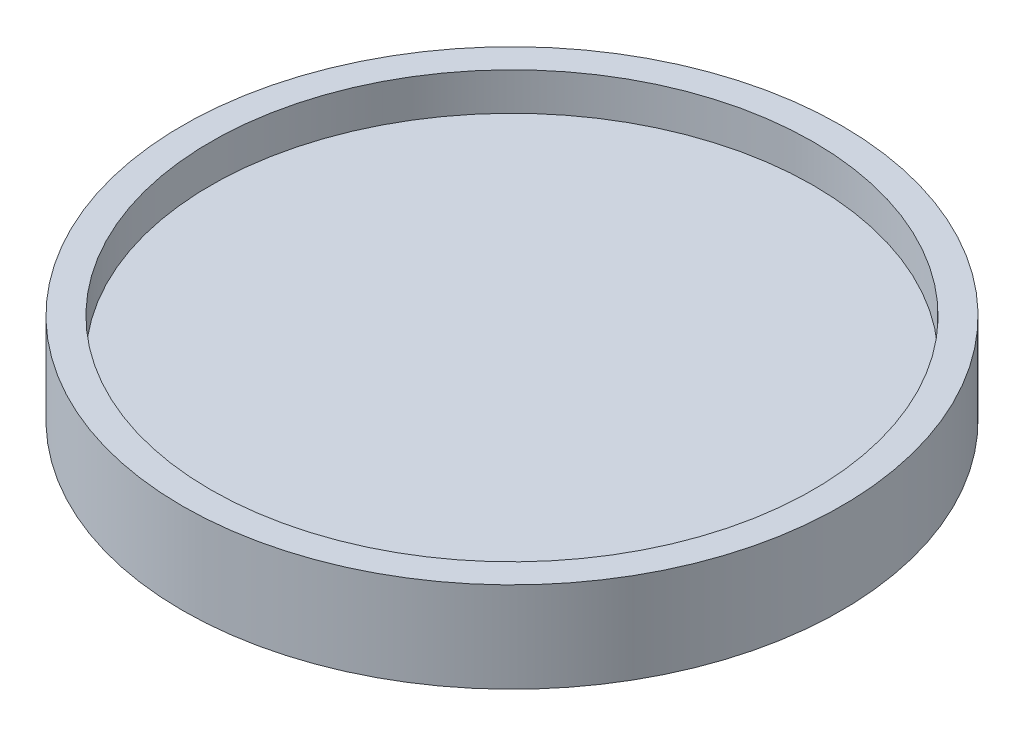
ISO-10303-21;
HEADER;
FILE_DESCRIPTION(('STEP AP214'),'2;1');
FILE_NAME('part.step','',(''),(''),'','','');
FILE_SCHEMA(('AUTOMOTIVE_DESIGN { 1 0 10303 214 1 1 1 1 }'));
ENDSEC;
DATA;
#1=APPLICATION_CONTEXT('core data for automotive mechanical design processes');
#2=APPLICATION_PROTOCOL_DEFINITION('international standard','automotive_design',2000,#1);
#3=PRODUCT_CONTEXT('',#1,'mechanical');
#4=PRODUCT('Part','Part','',(#3));
#5=PRODUCT_RELATED_PRODUCT_CATEGORY('part','',(#4));
#6=PRODUCT_DEFINITION_FORMATION('','',#4);
#7=PRODUCT_DEFINITION_CONTEXT('part definition',#1,'design');
#8=PRODUCT_DEFINITION('design','',#6,#7);
#9=PRODUCT_DEFINITION_SHAPE('','',#8);
#10=(LENGTH_UNIT() NAMED_UNIT(*) SI_UNIT(.MILLI.,.METRE.));
#11=(NAMED_UNIT(*) PLANE_ANGLE_UNIT() SI_UNIT($,.RADIAN.));
#12=(NAMED_UNIT(*) SI_UNIT($,.STERADIAN.) SOLID_ANGLE_UNIT());
#13=UNCERTAINTY_MEASURE_WITH_UNIT(LENGTH_MEASURE(1.E-05),#10,'distance_accuracy_value','');
#14=(GEOMETRIC_REPRESENTATION_CONTEXT(3) GLOBAL_UNCERTAINTY_ASSIGNED_CONTEXT((#13)) GLOBAL_UNIT_ASSIGNED_CONTEXT((#10,
#11,#12)) REPRESENTATION_CONTEXT('',''));
#15=CARTESIAN_POINT('',(0.,0.,0.));
#16=DIRECTION('',(0.,0.,1.));
#17=DIRECTION('',(1.,0.,0.));
#18=AXIS2_PLACEMENT_3D('',#15,#16,#17);
#19=CARTESIAN_POINT('',(0.,3.048,0.));
#20=DIRECTION('',(0.,-1.,0.));
#21=DIRECTION('',(0.,0.,-1.));
#22=AXIS2_PLACEMENT_3D('',#19,#20,#21);
#23=CYLINDRICAL_SURFACE('',#22,11.1125);
#24=CARTESIAN_POINT('',(0.,3.048,0.));
#25=DIRECTION('',(0.,1.,0.));
#26=DIRECTION('',(0.,0.,1.));
#27=AXIS2_PLACEMENT_3D('',#24,#25,#26);
#28=CIRCLE('',#27,11.1125);
#29=CARTESIAN_POINT('',(0.,3.048,-11.1125));
#30=VERTEX_POINT('',#29);
#31=EDGE_CURVE('E45',#30,#30,#28,.T.);
#32=CARTESIAN_POINT('',(0.,0.,0.));
#33=DIRECTION('',(0.,1.,0.));
#34=DIRECTION('',(0.,0.,1.));
#35=AXIS2_PLACEMENT_3D('',#32,#33,#34);
#36=CIRCLE('',#35,11.1125);
#37=CARTESIAN_POINT('',(0.,0.,-11.1125));
#38=VERTEX_POINT('',#37);
#39=EDGE_CURVE('E50',#38,#38,#36,.T.);
#40=CARTESIAN_POINT('',(0.,3.048,-11.1125));
#41=CARTESIAN_POINT('',(0.,3.01625,-11.1125));
#42=CARTESIAN_POINT('',(0.,2.9845,-11.1125));
#43=CARTESIAN_POINT('',(0.,2.921,-11.1125));
#44=CARTESIAN_POINT('',(0.,2.88925,-11.1125));
#45=CARTESIAN_POINT('',(0.,2.82575,-11.1125));
#46=CARTESIAN_POINT('',(0.,2.794,-11.1125));
#47=CARTESIAN_POINT('',(0.,2.7305,-11.1125));
#48=CARTESIAN_POINT('',(0.,2.69875,-11.1125));
#49=CARTESIAN_POINT('',(0.,2.63525,-11.1125));
#50=CARTESIAN_POINT('',(0.,2.6035,-11.1125));
#51=CARTESIAN_POINT('',(0.,2.54,-11.1125));
#52=CARTESIAN_POINT('',(0.,2.50825,-11.1125));
#53=CARTESIAN_POINT('',(0.,2.44475,-11.1125));
#54=CARTESIAN_POINT('',(0.,2.413,-11.1125));
#55=CARTESIAN_POINT('',(0.,2.3495,-11.1125));
#56=CARTESIAN_POINT('',(0.,2.31775,-11.1125));
#57=CARTESIAN_POINT('',(0.,2.25425,-11.1125));
#58=CARTESIAN_POINT('',(0.,2.2225,-11.1125));
#59=CARTESIAN_POINT('',(0.,2.159,-11.1125));
#60=CARTESIAN_POINT('',(0.,2.12725,-11.1125));
#61=CARTESIAN_POINT('',(0.,2.06375,-11.1125));
#62=CARTESIAN_POINT('',(0.,2.032,-11.1125));
#63=CARTESIAN_POINT('',(0.,1.9685,-11.1125));
#64=CARTESIAN_POINT('',(0.,1.93675,-11.1125));
#65=CARTESIAN_POINT('',(0.,1.87325,-11.1125));
#66=CARTESIAN_POINT('',(0.,1.8415,-11.1125));
#67=CARTESIAN_POINT('',(0.,1.778,-11.1125));
#68=CARTESIAN_POINT('',(0.,1.74625,-11.1125));
#69=CARTESIAN_POINT('',(0.,1.68275,-11.1125));
#70=CARTESIAN_POINT('',(0.,1.651,-11.1125));
#71=CARTESIAN_POINT('',(0.,1.5875,-11.1125));
#72=CARTESIAN_POINT('',(0.,1.55575,-11.1125));
#73=CARTESIAN_POINT('',(0.,1.49225,-11.1125));
#74=CARTESIAN_POINT('',(0.,1.4605,-11.1125));
#75=CARTESIAN_POINT('',(0.,1.397,-11.1125));
#76=CARTESIAN_POINT('',(0.,1.36525,-11.1125));
#77=CARTESIAN_POINT('',(0.,1.30175,-11.1125));
#78=CARTESIAN_POINT('',(0.,1.27,-11.1125));
#79=CARTESIAN_POINT('',(0.,1.2065,-11.1125));
#80=CARTESIAN_POINT('',(0.,1.17475,-11.1125));
#81=CARTESIAN_POINT('',(0.,1.11125,-11.1125));
#82=CARTESIAN_POINT('',(0.,1.0795,-11.1125));
#83=CARTESIAN_POINT('',(0.,1.016,-11.1125));
#84=CARTESIAN_POINT('',(0.,0.98425,-11.1125));
#85=CARTESIAN_POINT('',(0.,0.92075,-11.1125));
#86=CARTESIAN_POINT('',(0.,0.889,-11.1125));
#87=CARTESIAN_POINT('',(0.,0.8255,-11.1125));
#88=CARTESIAN_POINT('',(0.,0.79375,-11.1125));
#89=CARTESIAN_POINT('',(0.,0.73025,-11.1125));
#90=CARTESIAN_POINT('',(0.,0.6985,-11.1125));
#91=CARTESIAN_POINT('',(0.,0.635,-11.1125));
#92=CARTESIAN_POINT('',(0.,0.60325,-11.1125));
#93=CARTESIAN_POINT('',(0.,0.53975,-11.1125));
#94=CARTESIAN_POINT('',(0.,0.508,-11.1125));
#95=CARTESIAN_POINT('',(0.,0.4445,-11.1125));
#96=CARTESIAN_POINT('',(0.,0.41275,-11.1125));
#97=CARTESIAN_POINT('',(0.,0.34925,-11.1125));
#98=CARTESIAN_POINT('',(0.,0.3175,-11.1125));
#99=CARTESIAN_POINT('',(0.,0.254,-11.1125));
#100=CARTESIAN_POINT('',(0.,0.22225,-11.1125));
#101=CARTESIAN_POINT('',(0.,0.15875,-11.1125));
#102=CARTESIAN_POINT('',(0.,0.127,-11.1125));
#103=CARTESIAN_POINT('',(0.,0.0634999999999999,-11.1125));
#104=CARTESIAN_POINT('',(0.,0.03175,-11.1125));
#105=CARTESIAN_POINT('',(0.,0.,-11.1125));
#106=B_SPLINE_CURVE_WITH_KNOTS('',3,(#40,#41,#42,#43,#44,#45,#46,#47,#48,#49,#50,#51,#52,#53,
#54,#55,#56,#57,#58,#59,#60,#61,#62,#63,#64,#65,#66,#67,#68,#69,#70,#71,#72,#73,#74,#75,#76,#77,
#78,#79,#80,#81,#82,#83,#84,#85,#86,#87,#88,#89,#90,#91,#92,#93,#94,#95,#96,#97,#98,#99,#100,
#101,#102,#103,#104,#105),.UNSPECIFIED.,.F.,.F.,(4,2,2,2,2,2,2,2,2,2,2,2,2,2,2,2,2,2,2,2,2,2,2,
2,2,2,2,2,2,2,2,2,4),(0.,0.0952499999999998,0.1905,0.28575,0.381,0.47625,0.5715,0.66675,0.762,
0.85725,0.9525,1.04775,1.143,1.23825,1.3335,1.42875,1.524,1.61925,1.7145,1.80975,1.905,2.00025,
2.0955,2.19075,2.286,2.38125,2.4765,2.57175,2.667,2.76225,2.8575,2.95275,3.048),.UNSPECIFIED.);
#107=EDGE_CURVE('BSEAM37',#30,#38,#106,.T.);
#108=ORIENTED_EDGE('',*,*,#31,.F.);
#109=ORIENTED_EDGE('',*,*,#39,.T.);
#110=ORIENTED_EDGE('',*,*,#107,.T.);
#111=ORIENTED_EDGE('',*,*,#107,.F.);
#112=EDGE_LOOP('',(#108,#110,#109,#111));
#113=FACE_BOUND('',#112,.T.);
#114=ADVANCED_FACE('F37',(#113),#23,.T.);
#115=CARTESIAN_POINT('',(0.,3.048,0.));
#116=DIRECTION('',(0.,1.,0.));
#117=DIRECTION('',(0.,0.,1.));
#118=AXIS2_PLACEMENT_3D('',#115,#116,#117);
#119=PLANE('',#118);
#120=CARTESIAN_POINT('',(0.,3.048,0.));
#121=DIRECTION('',(0.,1.,0.));
#122=DIRECTION('',(0.,0.,1.));
#123=AXIS2_PLACEMENT_3D('',#120,#121,#122);
#124=CIRCLE('',#123,10.16);
#125=CARTESIAN_POINT('',(0.,3.048,10.16));
#126=VERTEX_POINT('',#125);
#127=EDGE_CURVE('E58',#126,#126,#124,.T.);
#128=ORIENTED_EDGE('',*,*,#127,.F.);
#129=EDGE_LOOP('',(#128));
#130=FACE_BOUND('',#129,.T.);
#131=ORIENTED_EDGE('',*,*,#31,.T.);
#132=EDGE_LOOP('',(#131));
#133=FACE_BOUND('',#132,.T.);
#134=ADVANCED_FACE('F80',(#130,#133),#119,.T.);
#135=CARTESIAN_POINT('',(0.,0.,0.));
#136=DIRECTION('',(0.,1.,0.));
#137=DIRECTION('',(0.,0.,1.));
#138=AXIS2_PLACEMENT_3D('',#135,#136,#137);
#139=PLANE('',#138);
#140=CARTESIAN_POINT('',(0.,0.,0.));
#141=DIRECTION('',(0.,1.,0.));
#142=DIRECTION('',(0.,0.,1.));
#143=AXIS2_PLACEMENT_3D('',#140,#141,#142);
#144=CIRCLE('',#143,9.86725185211907);
#145=CARTESIAN_POINT('',(0.,0.,9.86725185211907));
#146=VERTEX_POINT('',#145);
#147=EDGE_CURVE('E10',#146,#146,#144,.T.);
#148=ORIENTED_EDGE('',*,*,#147,.T.);
#149=EDGE_LOOP('',(#148));
#150=FACE_BOUND('',#149,.T.);
#151=ORIENTED_EDGE('',*,*,#39,.F.);
#152=EDGE_LOOP('',(#151));
#153=FACE_BOUND('',#152,.T.);
#154=ADVANCED_FACE('F85',(#150,#153),#139,.F.);
#155=CARTESIAN_POINT('',(0.,1.778,0.));
#156=DIRECTION('',(0.,1.,0.));
#157=DIRECTION('',(0.,0.,1.));
#158=AXIS2_PLACEMENT_3D('',#155,#156,#157);
#159=CYLINDRICAL_SURFACE('',#158,10.16);
#160=CARTESIAN_POINT('',(0.,1.778,0.));
#161=DIRECTION('',(0.,1.,0.));
#162=DIRECTION('',(0.,0.,1.));
#163=AXIS2_PLACEMENT_3D('',#160,#161,#162);
#164=CIRCLE('',#163,10.16);
#165=CARTESIAN_POINT('',(0.,1.778,10.16));
#166=VERTEX_POINT('',#165);
#167=EDGE_CURVE('E56',#166,#166,#164,.T.);
#168=ORIENTED_EDGE('',*,*,#167,.F.);
#169=EDGE_LOOP('',(#168));
#170=FACE_BOUND('',#169,.T.);
#171=ORIENTED_EDGE('',*,*,#127,.T.);
#172=EDGE_LOOP('',(#171));
#173=FACE_BOUND('',#172,.T.);
#174=ADVANCED_FACE('F91',(#170,#173),#159,.F.);
#175=CARTESIAN_POINT('',(0.,1.778,0.));
#176=DIRECTION('',(0.,1.,0.));
#177=DIRECTION('',(0.,0.,1.));
#178=AXIS2_PLACEMENT_3D('',#175,#176,#177);
#179=PLANE('',#178);
#180=ORIENTED_EDGE('',*,*,#167,.T.);
#181=EDGE_LOOP('',(#180));
#182=FACE_BOUND('',#181,.T.);
#183=ADVANCED_FACE('F77',(#182),#179,.T.);
#184=CARTESIAN_POINT('',(0.,1.27,0.));
#185=DIRECTION('',(0.,-1.,0.));
#186=DIRECTION('',(0.,0.,-1.));
#187=AXIS2_PLACEMENT_3D('',#184,#185,#186);
#188=PLANE('',#187);
#189=CARTESIAN_POINT('',(0.,1.27,0.));
#190=DIRECTION('',(0.,-1.,0.));
#191=DIRECTION('',(0.,0.,-1.));
#192=AXIS2_PLACEMENT_3D('',#189,#190,#191);
#193=CIRCLE('',#192,3.81);
#194=CARTESIAN_POINT('',(0.,1.27,-3.81));
#195=VERTEX_POINT('',#194);
#196=EDGE_CURVE('E62',#195,#195,#193,.T.);
#197=ORIENTED_EDGE('',*,*,#196,.T.);
#198=EDGE_LOOP('',(#197));
#199=FACE_BOUND('',#198,.T.);
#200=ADVANCED_FACE('F70',(#199),#188,.T.);
#201=CARTESIAN_POINT('',(0.,15.08,0.));
#202=DIRECTION('',(0.,1.,0.));
#203=DIRECTION('',(0.,0.,1.));
#204=AXIS2_PLACEMENT_3D('',#201,#202,#203);
#205=DEGENERATE_TOROIDAL_SURFACE('',#204,9.86725185211907,15.08,.T.);
#206=ORIENTED_EDGE('',*,*,#147,.F.);
#207=EDGE_LOOP('',(#206));
#208=FACE_BOUND('',#207,.T.);
#209=ORIENTED_EDGE('',*,*,#196,.F.);
#210=EDGE_LOOP('',(#209));
#211=FACE_BOUND('',#210,.T.);
#212=ADVANCED_FACE('F39',(#208,#211),#205,.T.);
#213=CLOSED_SHELL('',(#114,#134,#154,#174,#183,#200,#212));
#214=MANIFOLD_SOLID_BREP('B2',#213);
#215=ADVANCED_BREP_SHAPE_REPRESENTATION('',(#18,#214),#14);
#216=SHAPE_DEFINITION_REPRESENTATION(#9,#215);
ENDSEC;
END-ISO-10303-21;
